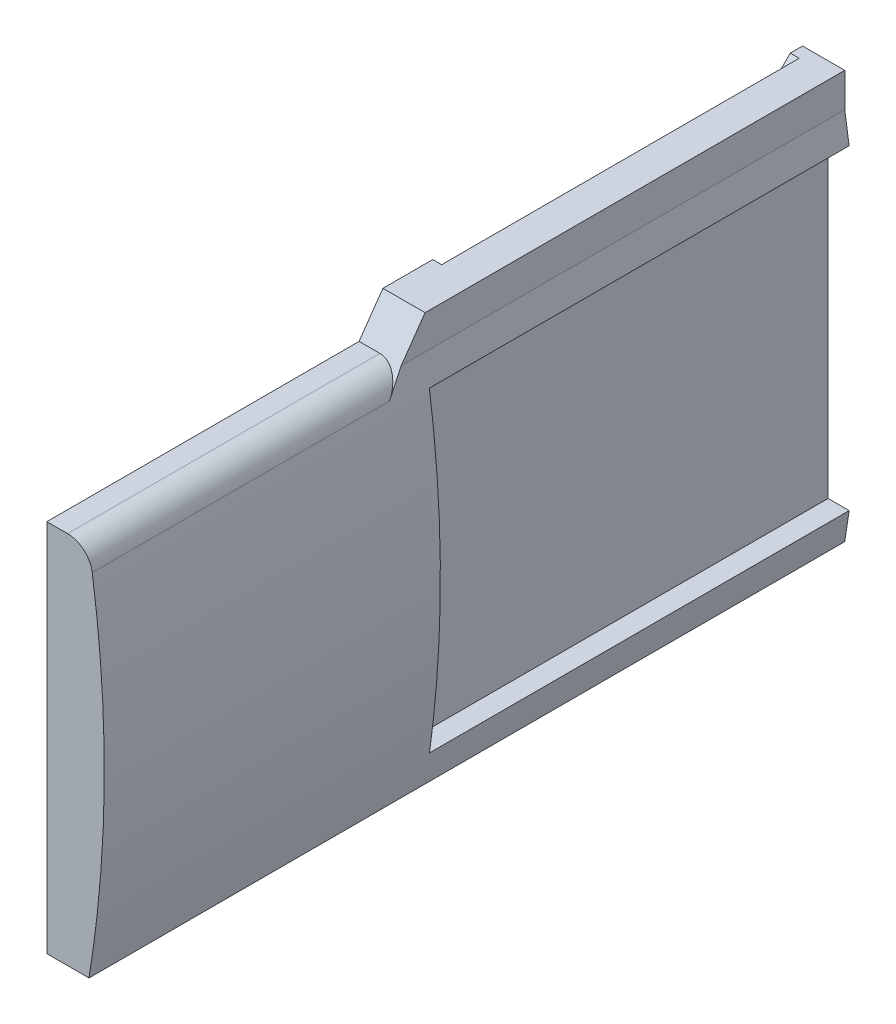
ISO-10303-21;
HEADER;
FILE_DESCRIPTION(('STEP AP214'),'2;1');
FILE_NAME('part.step','',(''),(''),'','','');
FILE_SCHEMA(('AUTOMOTIVE_DESIGN { 1 0 10303 214 1 1 1 1 }'));
ENDSEC;
DATA;
#1=APPLICATION_CONTEXT('core data for automotive mechanical design processes');
#2=APPLICATION_PROTOCOL_DEFINITION('international standard','automotive_design',2000,#1);
#3=PRODUCT_CONTEXT('',#1,'mechanical');
#4=PRODUCT('Part','Part','',(#3));
#5=PRODUCT_RELATED_PRODUCT_CATEGORY('part','',(#4));
#6=PRODUCT_DEFINITION_FORMATION('','',#4);
#7=PRODUCT_DEFINITION_CONTEXT('part definition',#1,'design');
#8=PRODUCT_DEFINITION('design','',#6,#7);
#9=PRODUCT_DEFINITION_SHAPE('','',#8);
#10=(LENGTH_UNIT() NAMED_UNIT(*) SI_UNIT(.MILLI.,.METRE.));
#11=(NAMED_UNIT(*) PLANE_ANGLE_UNIT() SI_UNIT($,.RADIAN.));
#12=(NAMED_UNIT(*) SI_UNIT($,.STERADIAN.) SOLID_ANGLE_UNIT());
#13=UNCERTAINTY_MEASURE_WITH_UNIT(LENGTH_MEASURE(1.E-05),#10,'distance_accuracy_value','');
#14=(GEOMETRIC_REPRESENTATION_CONTEXT(3) GLOBAL_UNCERTAINTY_ASSIGNED_CONTEXT((#13)) GLOBAL_UNIT_ASSIGNED_CONTEXT((#10,
#11,#12)) REPRESENTATION_CONTEXT('',''));
#15=CARTESIAN_POINT('',(0.,0.,0.));
#16=DIRECTION('',(0.,0.,1.));
#17=DIRECTION('',(1.,0.,0.));
#18=AXIS2_PLACEMENT_3D('',#15,#16,#17);
#19=CARTESIAN_POINT('',(100.042732586601,67.2945092184182,144.836492831407));
#20=DIRECTION('',(0.,-1.,0.));
#21=DIRECTION('',(0.,0.,-1.));
#22=AXIS2_PLACEMENT_3D('',#19,#20,#21);
#23=PLANE('',#22);
#24=DIRECTION('',(-1.,0.,0.));
#25=VECTOR('',#24,1.);
#26=CARTESIAN_POINT('',(100.042732586601,67.2945092184182,65.6364928314073));
#27=LINE('',#26,#25);
#28=CARTESIAN_POINT('',(94.9439960601416,67.2945092184182,65.6364928314073));
#29=VERTEX_POINT('',#28);
#30=CARTESIAN_POINT('',(90.,67.2945092184182,65.6364928314073));
#31=VERTEX_POINT('',#30);
#32=EDGE_CURVE('E187',#29,#31,#27,.T.);
#33=ORIENTED_EDGE('',*,*,#32,.T.);
#34=DIRECTION('',(0.,0.,1.));
#35=VECTOR('',#34,1.);
#36=CARTESIAN_POINT('',(90.,67.2945092184182,144.836492831407));
#37=LINE('',#36,#35);
#38=CARTESIAN_POINT('',(90.,67.2945092184182,140.));
#39=VERTEX_POINT('',#38);
#40=EDGE_CURVE('E185',#31,#39,#37,.T.);
#41=ORIENTED_EDGE('',*,*,#40,.T.);
#42=DIRECTION('',(-1.,0.,0.));
#43=VECTOR('',#42,1.);
#44=CARTESIAN_POINT('',(100.042732586601,67.2945092184182,140.));
#45=LINE('',#44,#43);
#46=CARTESIAN_POINT('',(94.9439960601416,67.2945092184182,140.));
#47=VERTEX_POINT('',#46);
#48=EDGE_CURVE('E173',#47,#39,#45,.T.);
#49=ORIENTED_EDGE('',*,*,#48,.F.);
#50=DIRECTION('',(0.,0.,1.));
#51=VECTOR('',#50,1.);
#52=CARTESIAN_POINT('',(94.9439960601416,67.2945092184182,65.6364928314073));
#53=LINE('',#52,#51);
#54=EDGE_CURVE('E364',#47,#29,#53,.F.);
#55=ORIENTED_EDGE('',*,*,#54,.T.);
#56=EDGE_LOOP('',(#33,#41,#49,#55));
#57=FACE_BOUND('',#56,.T.);
#58=ADVANCED_FACE('F63',(#57),#23,.F.);
#59=CARTESIAN_POINT('',(100.042732586601,-21.8054907815818,-54.6203206083434));
#60=DIRECTION('',(0.,1.,0.));
#61=DIRECTION('',(0.,0.,1.));
#62=AXIS2_PLACEMENT_3D('',#59,#60,#61);
#63=PLANE('',#62);
#64=DIRECTION('',(1.,0.,0.));
#65=VECTOR('',#64,1.);
#66=CARTESIAN_POINT('',(100.042732586601,-21.8054907815818,140.));
#67=LINE('',#66,#65);
#68=CARTESIAN_POINT('',(90.,-21.8054907815818,140.));
#69=VERTEX_POINT('',#68);
#70=CARTESIAN_POINT('',(100.042732586601,-21.8054907815818,140.));
#71=VERTEX_POINT('',#70);
#72=EDGE_CURVE('E181',#69,#71,#67,.T.);
#73=ORIENTED_EDGE('',*,*,#72,.F.);
#74=DIRECTION('',(0.,0.,-1.));
#75=VECTOR('',#74,1.);
#76=CARTESIAN_POINT('',(90.,-21.8054907815818,-54.6203206083434));
#77=LINE('',#76,#75);
#78=CARTESIAN_POINT('',(90.,-21.8054907815818,-40.));
#79=VERTEX_POINT('',#78);
#80=EDGE_CURVE('E79',#69,#79,#77,.T.);
#81=ORIENTED_EDGE('',*,*,#80,.T.);
#82=DIRECTION('',(1.,0.,0.));
#83=VECTOR('',#82,1.);
#84=CARTESIAN_POINT('',(100.042732586601,-21.8054907815818,-40.));
#85=LINE('',#84,#83);
#86=CARTESIAN_POINT('',(100.042732586601,-21.8054907815818,-40.));
#87=VERTEX_POINT('',#86);
#88=EDGE_CURVE('E234',#79,#87,#85,.T.);
#89=ORIENTED_EDGE('',*,*,#88,.T.);
#90=DIRECTION('',(0.,0.,-1.));
#91=VECTOR('',#90,1.);
#92=CARTESIAN_POINT('',(100.042732586601,-21.8054907815818,-54.6203206083434));
#93=LINE('',#92,#91);
#94=EDGE_CURVE('E356',#71,#87,#93,.T.);
#95=ORIENTED_EDGE('',*,*,#94,.F.);
#96=EDGE_LOOP('',(#73,#81,#89,#95));
#97=FACE_BOUND('',#96,.T.);
#98=ADVANCED_FACE('F302',(#97),#63,.F.);
#99=CARTESIAN_POINT('',(100.042732586601,67.2945092184182,311.41423626744));
#100=CARTESIAN_POINT('',(107.332112739832,22.4140596268838,311.41423626744));
#101=CARTESIAN_POINT('',(100.042732586601,-21.8054907815818,311.41423626744));
#102=B_SPLINE_CURVE_WITH_KNOTS('',2,(#99,#100,#101),.UNSPECIFIED.,.F.,.F.,(3,3),(0.,1.),.UNSPECIFIED.);
#103=DIRECTION('',(0.,0.,-1.));
#104=VECTOR('',#103,1.);
#105=SURFACE_OF_LINEAR_EXTRUSION('',#102,#104);
#106=DIRECTION('',(0.,0.,-1.));
#107=VECTOR('',#106,1.);
#108=CARTESIAN_POINT('',(100.823268570737,62.2017132942812,69.2025069280518));
#109=LINE('',#108,#107);
#110=CARTESIAN_POINT('',(100.823268570737,62.2017132942812,69.2025069280518));
#111=VERTEX_POINT('',#110);
#112=CARTESIAN_POINT('',(100.823268570737,62.2017132942812,140.));
#113=VERTEX_POINT('',#112);
#114=EDGE_CURVE('E319',#111,#113,#109,.F.);
#115=ORIENTED_EDGE('',*,*,#114,.T.);
#116=CARTESIAN_POINT('',(100.042732586601,67.2945092184182,140.));
#117=CARTESIAN_POINT('',(107.332112739832,22.4140596268838,140.));
#118=CARTESIAN_POINT('',(100.042732586601,-21.8054907815818,140.));
#119=B_SPLINE_CURVE_WITH_KNOTS('',2,(#116,#117,#118),.UNSPECIFIED.,.F.,.F.,(3,3),(0.,1.),.UNSPECIFIED.);
#120=EDGE_CURVE('E216',#113,#71,#119,.T.);
#121=ORIENTED_EDGE('',*,*,#120,.T.);
#122=ORIENTED_EDGE('',*,*,#94,.T.);
#123=CARTESIAN_POINT('',(100.042732586601,67.2945092184182,-40.));
#124=CARTESIAN_POINT('',(107.332112739832,22.4140596268838,-40.));
#125=CARTESIAN_POINT('',(100.042732586601,-21.8054907815818,-40.));
#126=B_SPLINE_CURVE_WITH_KNOTS('',2,(#123,#124,#125),.UNSPECIFIED.,.F.,.F.,(3,3),(0.,1.),.UNSPECIFIED.);
#127=CARTESIAN_POINT('',(101.095030730516,-14.8754907815819,-40.));
#128=VERTEX_POINT('',#127);
#129=EDGE_CURVE('E237',#128,#87,#126,.T.);
#130=ORIENTED_EDGE('',*,*,#129,.F.);
#131=DIRECTION('',(0.,0.,-1.));
#132=VECTOR('',#131,1.);
#133=CARTESIAN_POINT('',(101.095030730516,-14.875490781582,68.0911060975608));
#134=LINE('',#133,#132);
#135=CARTESIAN_POINT('',(101.095030730516,-14.875490781582,59.958086111532));
#136=VERTEX_POINT('',#135);
#137=EDGE_CURVE('E377',#136,#128,#134,.T.);
#138=ORIENTED_EDGE('',*,*,#137,.F.);
#139=CARTESIAN_POINT('',(100.042732586601,67.2945092184182,59.958086111532));
#140=CARTESIAN_POINT('',(107.332112739832,22.4140596268838,59.958086111532));
#141=CARTESIAN_POINT('',(100.042732586601,-21.8054907815818,59.958086111532));
#142=B_SPLINE_CURVE_WITH_KNOTS('',2,(#139,#140,#141),.UNSPECIFIED.,.F.,.F.,(3,3),(0.,1.),.UNSPECIFIED.);
#143=CARTESIAN_POINT('',(101.081930401724,60.3645092184182,59.958086111532));
#144=VERTEX_POINT('',#143);
#145=EDGE_CURVE('E389',#144,#136,#142,.T.);
#146=ORIENTED_EDGE('',*,*,#145,.F.);
#147=DIRECTION('',(0.,0.,-1.));
#148=VECTOR('',#147,1.);
#149=CARTESIAN_POINT('',(101.081930401724,60.3645092184181,68.0911060975608));
#150=LINE('',#149,#148);
#151=CARTESIAN_POINT('',(101.081930401733,60.3645092183522,-40.));
#152=VERTEX_POINT('',#151);
#153=EDGE_CURVE('E386',#152,#144,#150,.F.);
#154=ORIENTED_EDGE('',*,*,#153,.F.);
#155=CARTESIAN_POINT('',(100.042732586601,67.2945092184182,-40.));
#156=VERTEX_POINT('',#155);
#157=EDGE_CURVE('E243',#156,#152,#126,.T.);
#158=ORIENTED_EDGE('',*,*,#157,.F.);
#159=DIRECTION('',(0.,0.,-1.));
#160=VECTOR('',#159,1.);
#161=CARTESIAN_POINT('',(100.042732586601,67.2945092184182,311.41423626744));
#162=LINE('',#161,#160);
#163=CARTESIAN_POINT('',(100.042732586601,67.2945092184182,65.6364928314073));
#164=VERTEX_POINT('',#163);
#165=EDGE_CURVE('E285',#164,#156,#162,.T.);
#166=ORIENTED_EDGE('',*,*,#165,.F.);
#167=CARTESIAN_POINT('',(100.042732586601,67.2945092184182,65.6364928314073));
#168=CARTESIAN_POINT('',(100.180475250771,66.4464969731168,66.2302773980615));
#169=CARTESIAN_POINT('',(100.314391248202,65.5980911901213,66.8243375227756));
#170=CARTESIAN_POINT('',(100.57456990958,63.9004925487423,68.0130088883238));
#171=CARTESIAN_POINT('',(100.700832573529,63.0512996903588,68.6076201291578));
#172=CARTESIAN_POINT('',(100.823268570737,62.2017132942812,69.2025069280518));
#173=B_SPLINE_CURVE_WITH_KNOTS('',3,(#167,#168,#169,#170,#171,#172),.UNSPECIFIED.,.F.,.F.,(4,2,
4),(0.,3.13300170585157,6.26600341170315),.UNSPECIFIED.);
#174=EDGE_CURVE('E309',#164,#111,#173,.T.);
#175=ORIENTED_EDGE('',*,*,#174,.T.);
#176=EDGE_LOOP('',(#115,#121,#122,#130,#138,#146,#154,#158,#166,#175));
#177=FACE_BOUND('',#176,.T.);
#178=ADVANCED_FACE('F297',(#177),#105,.T.);
#179=CARTESIAN_POINT('',(94.9439960601416,61.3545092184182,105.236492831407));
#180=DIRECTION('',(0.,0.,-1.));
#181=DIRECTION('',(0.,1.,0.));
#182=AXIS2_PLACEMENT_3D('',#179,#180,#181);
#183=CYLINDRICAL_SURFACE('',#182,5.94);
#184=ORIENTED_EDGE('',*,*,#54,.F.);
#185=CARTESIAN_POINT('',(94.9439960601416,61.3545092184182,140.));
#186=DIRECTION('',(0.,0.,1.));
#187=DIRECTION('',(1.,0.,0.));
#188=AXIS2_PLACEMENT_3D('',#185,#186,#187);
#189=CIRCLE('',#188,5.94);
#190=EDGE_CURVE('E72',#47,#113,#189,.F.);
#191=ORIENTED_EDGE('',*,*,#190,.T.);
#192=ORIENTED_EDGE('',*,*,#114,.F.);
#193=CARTESIAN_POINT('',(94.9439960601416,61.3545092184182,69.795725608373));
#194=DIRECTION('',(0.,-0.573576436351045,-0.819152044288993));
#195=DIRECTION('',(0.,0.819152044288993,-0.573576436351045));
#196=AXIS2_PLACEMENT_3D('',#193,#194,#195);
#197=ELLIPSE('',#196,7.25140105724304,5.94);
#198=EDGE_CURVE('E366',#29,#111,#197,.T.);
#199=ORIENTED_EDGE('',*,*,#198,.F.);
#200=EDGE_LOOP('',(#184,#191,#192,#199));
#201=FACE_BOUND('',#200,.T.);
#202=ADVANCED_FACE('F65',(#201),#183,.T.);
#203=CARTESIAN_POINT('',(0.,0.,-40.));
#204=DIRECTION('',(0.,0.,1.));
#205=DIRECTION('',(1.,0.,0.));
#206=AXIS2_PLACEMENT_3D('',#203,#204,#205);
#207=PLANE('',#206);
#208=ORIENTED_EDGE('',*,*,#88,.F.);
#209=DIRECTION('',(0.,1.,0.));
#210=VECTOR('',#209,1.);
#211=CARTESIAN_POINT('',(90.,0.,-40.));
#212=LINE('',#211,#210);
#213=CARTESIAN_POINT('',(90.,75.4041144568792,-40.));
#214=VERTEX_POINT('',#213);
#215=EDGE_CURVE('E196',#79,#214,#212,.T.);
#216=ORIENTED_EDGE('',*,*,#215,.T.);
#217=DIRECTION('',(-1.,0.,0.));
#218=VECTOR('',#217,1.);
#219=CARTESIAN_POINT('',(100.042732586601,75.4041144568792,-40.));
#220=LINE('',#219,#218);
#221=CARTESIAN_POINT('',(100.042732586601,75.4041144568792,-40.));
#222=VERTEX_POINT('',#221);
#223=EDGE_CURVE('E180',#222,#214,#220,.T.);
#224=ORIENTED_EDGE('',*,*,#223,.F.);
#225=DIRECTION('',(0.,1.,0.));
#226=VECTOR('',#225,1.);
#227=CARTESIAN_POINT('',(100.042732586601,-21.8054907815818,-40.));
#228=LINE('',#227,#226);
#229=EDGE_CURVE('E230',#156,#222,#228,.T.);
#230=ORIENTED_EDGE('',*,*,#229,.F.);
#231=ORIENTED_EDGE('',*,*,#157,.T.);
#232=DIRECTION('',(1.,0.,0.));
#233=VECTOR('',#232,1.);
#234=CARTESIAN_POINT('',(96.0827325866005,60.3645092184182,-40.));
#235=LINE('',#234,#233);
#236=CARTESIAN_POINT('',(96.0827325866005,60.3645092184182,-40.));
#237=VERTEX_POINT('',#236);
#238=EDGE_CURVE('E251',#237,#152,#235,.T.);
#239=ORIENTED_EDGE('',*,*,#238,.F.);
#240=DIRECTION('',(0.,-1.,0.));
#241=VECTOR('',#240,1.);
#242=CARTESIAN_POINT('',(96.0827325866005,-21.8054907815818,-40.));
#243=LINE('',#242,#241);
#244=CARTESIAN_POINT('',(96.0827325866005,-14.8754907815818,-40.));
#245=VERTEX_POINT('',#244);
#246=EDGE_CURVE('E255',#237,#245,#243,.T.);
#247=ORIENTED_EDGE('',*,*,#246,.T.);
#248=DIRECTION('',(-1.,0.,0.));
#249=VECTOR('',#248,1.);
#250=CARTESIAN_POINT('',(96.0827325866005,-14.8754907815818,-40.));
#251=LINE('',#250,#249);
#252=EDGE_CURVE('E244',#128,#245,#251,.T.);
#253=ORIENTED_EDGE('',*,*,#252,.F.);
#254=ORIENTED_EDGE('',*,*,#129,.T.);
#255=EDGE_LOOP('',(#208,#216,#224,#230,#231,#239,#247,#253,#254));
#256=FACE_BOUND('',#255,.T.);
#257=ADVANCED_FACE('F341',(#256),#207,.F.);
#258=CARTESIAN_POINT('',(92.1227325866005,75.4041144568792,48.078086111532));
#259=DIRECTION('',(0.,-0.707106781186547,0.707106781186547));
#260=DIRECTION('',(-1.,0.,0.));
#261=AXIS2_PLACEMENT_3D('',#258,#259,#260);
#262=PLANE('',#261);
#263=DIRECTION('',(-0.577350269189626,-0.577350269189626,-0.577350269189626));
#264=VECTOR('',#263,1.);
#265=CARTESIAN_POINT('',(92.1227325866005,75.4041144568792,48.078086111532));
#266=LINE('',#265,#264);
#267=CARTESIAN_POINT('',(92.1227325866005,75.4041144568792,48.078086111532));
#268=VERTEX_POINT('',#267);
#269=CARTESIAN_POINT('',(90.,73.2813818702787,45.9553535249315));
#270=VERTEX_POINT('',#269);
#271=EDGE_CURVE('E320',#268,#270,#266,.T.);
#272=ORIENTED_EDGE('',*,*,#271,.T.);
#273=DIRECTION('',(0.,0.707106781186548,0.707106781186548));
#274=VECTOR('',#273,1.);
#275=CARTESIAN_POINT('',(90.,75.4041144568792,48.078086111532));
#276=LINE('',#275,#274);
#277=CARTESIAN_POINT('',(90.,75.4041144568792,48.078086111532));
#278=VERTEX_POINT('',#277);
#279=EDGE_CURVE('E205',#270,#278,#276,.T.);
#280=ORIENTED_EDGE('',*,*,#279,.T.);
#281=DIRECTION('',(1.,0.,0.));
#282=VECTOR('',#281,1.);
#283=CARTESIAN_POINT('',(92.1227325866005,75.4041144568792,48.078086111532));
#284=LINE('',#283,#282);
#285=EDGE_CURVE('E258',#278,#268,#284,.T.);
#286=ORIENTED_EDGE('',*,*,#285,.T.);
#287=EDGE_LOOP('',(#272,#280,#286));
#288=FACE_BOUND('',#287,.T.);
#289=ADVANCED_FACE('F339',(#288),#262,.F.);
#290=CARTESIAN_POINT('',(92.1227325866005,75.4041144568792,48.078086111532));
#291=DIRECTION('',(0.707106781186548,-0.707106781186547,0.));
#292=DIRECTION('',(0.,0.,1.));
#293=AXIS2_PLACEMENT_3D('',#290,#291,#292);
#294=PLANE('',#293);
#295=DIRECTION('',(-0.577350269189626,-0.577350269189626,0.577350269189626));
#296=VECTOR('',#295,1.);
#297=CARTESIAN_POINT('',(92.1227325866005,75.4041144568792,-37.061913888468));
#298=LINE('',#297,#296);
#299=CARTESIAN_POINT('',(92.1227325866005,75.4041144568792,-37.061913888468));
#300=VERTEX_POINT('',#299);
#301=CARTESIAN_POINT('',(90.,73.2813818702787,-34.9391813018675));
#302=VERTEX_POINT('',#301);
#303=EDGE_CURVE('E394',#300,#302,#298,.T.);
#304=ORIENTED_EDGE('',*,*,#303,.T.);
#305=DIRECTION('',(0.,0.,1.));
#306=VECTOR('',#305,1.);
#307=CARTESIAN_POINT('',(90.,73.2813818702787,48.078086111532));
#308=LINE('',#307,#306);
#309=EDGE_CURVE('E87',#302,#270,#308,.T.);
#310=ORIENTED_EDGE('',*,*,#309,.T.);
#311=ORIENTED_EDGE('',*,*,#271,.F.);
#312=DIRECTION('',(0.,0.,-1.));
#313=VECTOR('',#312,1.);
#314=CARTESIAN_POINT('',(92.1227325866005,75.4041144568792,48.078086111532));
#315=LINE('',#314,#313);
#316=EDGE_CURVE('E261',#268,#300,#315,.T.);
#317=ORIENTED_EDGE('',*,*,#316,.T.);
#318=EDGE_LOOP('',(#304,#310,#311,#317));
#319=FACE_BOUND('',#318,.T.);
#320=ADVANCED_FACE('F336',(#319),#294,.F.);
#321=CARTESIAN_POINT('',(92.1227325866005,75.4041144568792,-37.061913888468));
#322=DIRECTION('',(0.,-0.707106781186547,-0.707106781186548));
#323=DIRECTION('',(1.,0.,0.));
#324=AXIS2_PLACEMENT_3D('',#321,#322,#323);
#325=PLANE('',#324);
#326=DIRECTION('',(-1.,0.,0.));
#327=VECTOR('',#326,1.);
#328=CARTESIAN_POINT('',(92.1227325866005,75.4041144568792,-37.061913888468));
#329=LINE('',#328,#327);
#330=CARTESIAN_POINT('',(90.,75.4041144568792,-37.061913888468));
#331=VERTEX_POINT('',#330);
#332=EDGE_CURVE('E265',#300,#331,#329,.T.);
#333=ORIENTED_EDGE('',*,*,#332,.T.);
#334=DIRECTION('',(0.,-0.707106781186548,0.707106781186547));
#335=VECTOR('',#334,1.);
#336=CARTESIAN_POINT('',(90.,75.4041144568792,-37.061913888468));
#337=LINE('',#336,#335);
#338=EDGE_CURVE('E211',#331,#302,#337,.T.);
#339=ORIENTED_EDGE('',*,*,#338,.T.);
#340=ORIENTED_EDGE('',*,*,#303,.F.);
#341=EDGE_LOOP('',(#333,#339,#340));
#342=FACE_BOUND('',#341,.T.);
#343=ADVANCED_FACE('F332',(#342),#325,.F.);
#344=CARTESIAN_POINT('',(100.042732586601,75.4041144568792,59.958086111532));
#345=DIRECTION('',(0.,-1.,0.));
#346=DIRECTION('',(0.,0.,-1.));
#347=AXIS2_PLACEMENT_3D('',#344,#345,#346);
#348=PLANE('',#347);
#349=ORIENTED_EDGE('',*,*,#223,.T.);
#350=DIRECTION('',(0.,0.,1.));
#351=VECTOR('',#350,1.);
#352=CARTESIAN_POINT('',(90.,75.4041144568792,59.958086111532));
#353=LINE('',#352,#351);
#354=EDGE_CURVE('E206',#214,#331,#353,.T.);
#355=ORIENTED_EDGE('',*,*,#354,.T.);
#356=ORIENTED_EDGE('',*,*,#332,.F.);
#357=ORIENTED_EDGE('',*,*,#316,.F.);
#358=ORIENTED_EDGE('',*,*,#285,.F.);
#359=CARTESIAN_POINT('',(90.,75.4041144568792,59.958086111532));
#360=VERTEX_POINT('',#359);
#361=EDGE_CURVE('E202',#278,#360,#353,.T.);
#362=ORIENTED_EDGE('',*,*,#361,.T.);
#363=DIRECTION('',(-1.,0.,0.));
#364=VECTOR('',#363,1.);
#365=CARTESIAN_POINT('',(100.042732586601,75.4041144568792,59.958086111532));
#366=LINE('',#365,#364);
#367=CARTESIAN_POINT('',(100.042732586601,75.4041144568792,59.958086111532));
#368=VERTEX_POINT('',#367);
#369=EDGE_CURVE('E373',#368,#360,#366,.T.);
#370=ORIENTED_EDGE('',*,*,#369,.F.);
#371=DIRECTION('',(0.,0.,1.));
#372=VECTOR('',#371,1.);
#373=CARTESIAN_POINT('',(100.042732586601,75.4041144568792,59.958086111532));
#374=LINE('',#373,#372);
#375=EDGE_CURVE('E411',#222,#368,#374,.T.);
#376=ORIENTED_EDGE('',*,*,#375,.F.);
#377=EDGE_LOOP('',(#349,#355,#356,#357,#358,#362,#370,#376));
#378=FACE_BOUND('',#377,.T.);
#379=ADVANCED_FACE('F328',(#378),#348,.F.);
#380=CARTESIAN_POINT('',(100.042732586601,67.2945092184182,65.6364928314073));
#381=DIRECTION('',(0.,-0.573576436351045,-0.819152044288993));
#382=DIRECTION('',(0.,0.819152044288993,-0.573576436351045));
#383=AXIS2_PLACEMENT_3D('',#380,#381,#382);
#384=PLANE('',#383);
#385=ORIENTED_EDGE('',*,*,#369,.T.);
#386=DIRECTION('',(0.,-0.819152044288993,0.573576436351045));
#387=VECTOR('',#386,1.);
#388=CARTESIAN_POINT('',(90.,67.2945092184182,65.6364928314073));
#389=LINE('',#388,#387);
#390=EDGE_CURVE('E191',#360,#31,#389,.T.);
#391=ORIENTED_EDGE('',*,*,#390,.T.);
#392=ORIENTED_EDGE('',*,*,#32,.F.);
#393=ORIENTED_EDGE('',*,*,#198,.T.);
#394=ORIENTED_EDGE('',*,*,#174,.F.);
#395=DIRECTION('',(0.,-0.819152044288993,0.573576436351045));
#396=VECTOR('',#395,1.);
#397=CARTESIAN_POINT('',(100.042732586601,67.2945092184182,65.6364928314073));
#398=LINE('',#397,#396);
#399=EDGE_CURVE('E379',#368,#164,#398,.T.);
#400=ORIENTED_EDGE('',*,*,#399,.F.);
#401=EDGE_LOOP('',(#385,#391,#392,#393,#394,#400));
#402=FACE_BOUND('',#401,.T.);
#403=ADVANCED_FACE('F323',(#402),#384,.F.);
#404=CARTESIAN_POINT('',(100.042732586601,-21.8054907815818,-54.6203206083434));
#405=DIRECTION('',(-1.,0.,0.));
#406=DIRECTION('',(0.,0.,1.));
#407=AXIS2_PLACEMENT_3D('',#404,#405,#406);
#408=PLANE('',#407);
#409=ORIENTED_EDGE('',*,*,#165,.T.);
#410=ORIENTED_EDGE('',*,*,#229,.T.);
#411=ORIENTED_EDGE('',*,*,#375,.T.);
#412=ORIENTED_EDGE('',*,*,#399,.T.);
#413=EDGE_LOOP('',(#409,#410,#411,#412));
#414=FACE_BOUND('',#413,.T.);
#415=ADVANCED_FACE('F306',(#414),#408,.F.);
#416=CARTESIAN_POINT('',(96.0827325866005,60.3645092184182,59.958086111532));
#417=DIRECTION('',(0.,0.,1.));
#418=DIRECTION('',(0.,-1.,0.));
#419=AXIS2_PLACEMENT_3D('',#416,#417,#418);
#420=PLANE('',#419);
#421=ORIENTED_EDGE('',*,*,#145,.T.);
#422=DIRECTION('',(1.,0.,0.));
#423=VECTOR('',#422,1.);
#424=CARTESIAN_POINT('',(96.0827325866005,-14.8754907815818,59.958086111532));
#425=LINE('',#424,#423);
#426=CARTESIAN_POINT('',(96.0827325866005,-14.8754907815818,59.958086111532));
#427=VERTEX_POINT('',#426);
#428=EDGE_CURVE('E280',#427,#136,#425,.T.);
#429=ORIENTED_EDGE('',*,*,#428,.F.);
#430=DIRECTION('',(0.,-1.,0.));
#431=VECTOR('',#430,1.);
#432=CARTESIAN_POINT('',(96.0827325866005,60.3645092184182,59.958086111532));
#433=LINE('',#432,#431);
#434=CARTESIAN_POINT('',(96.0827325866005,60.3645092184182,59.958086111532));
#435=VERTEX_POINT('',#434);
#436=EDGE_CURVE('E269',#435,#427,#433,.T.);
#437=ORIENTED_EDGE('',*,*,#436,.F.);
#438=DIRECTION('',(1.,0.,0.));
#439=VECTOR('',#438,1.);
#440=CARTESIAN_POINT('',(96.0827325866005,60.3645092184182,59.958086111532));
#441=LINE('',#440,#439);
#442=EDGE_CURVE('E281',#435,#144,#441,.T.);
#443=ORIENTED_EDGE('',*,*,#442,.T.);
#444=EDGE_LOOP('',(#421,#429,#437,#443));
#445=FACE_BOUND('',#444,.T.);
#446=ADVANCED_FACE('F304',(#445),#420,.F.);
#447=CARTESIAN_POINT('',(96.0827325866005,60.3645092184182,59.958086111532));
#448=DIRECTION('',(0.,1.,0.));
#449=DIRECTION('',(0.,0.,1.));
#450=AXIS2_PLACEMENT_3D('',#447,#448,#449);
#451=PLANE('',#450);
#452=DIRECTION('',(0.,0.,1.));
#453=VECTOR('',#452,1.);
#454=CARTESIAN_POINT('',(96.0827325866005,60.3645092184182,59.958086111532));
#455=LINE('',#454,#453);
#456=EDGE_CURVE('E277',#237,#435,#455,.T.);
#457=ORIENTED_EDGE('',*,*,#456,.F.);
#458=ORIENTED_EDGE('',*,*,#238,.T.);
#459=ORIENTED_EDGE('',*,*,#153,.T.);
#460=ORIENTED_EDGE('',*,*,#442,.F.);
#461=EDGE_LOOP('',(#457,#458,#459,#460));
#462=FACE_BOUND('',#461,.T.);
#463=ADVANCED_FACE('F429',(#462),#451,.F.);
#464=CARTESIAN_POINT('',(96.0827325866005,-14.8754907815818,59.958086111532));
#465=DIRECTION('',(0.,-1.,0.));
#466=DIRECTION('',(0.,0.,-1.));
#467=AXIS2_PLACEMENT_3D('',#464,#465,#466);
#468=PLANE('',#467);
#469=ORIENTED_EDGE('',*,*,#137,.T.);
#470=ORIENTED_EDGE('',*,*,#252,.T.);
#471=DIRECTION('',(0.,0.,-1.));
#472=VECTOR('',#471,1.);
#473=CARTESIAN_POINT('',(96.0827325866005,-14.8754907815818,59.958086111532));
#474=LINE('',#473,#472);
#475=EDGE_CURVE('E273',#427,#245,#474,.T.);
#476=ORIENTED_EDGE('',*,*,#475,.F.);
#477=ORIENTED_EDGE('',*,*,#428,.T.);
#478=EDGE_LOOP('',(#469,#470,#476,#477));
#479=FACE_BOUND('',#478,.T.);
#480=ADVANCED_FACE('F422',(#479),#468,.F.);
#481=CARTESIAN_POINT('',(96.0827325866005,-21.8054907815818,-54.6203206083434));
#482=DIRECTION('',(1.,0.,0.));
#483=DIRECTION('',(0.,0.,-1.));
#484=AXIS2_PLACEMENT_3D('',#481,#482,#483);
#485=PLANE('',#484);
#486=ORIENTED_EDGE('',*,*,#246,.F.);
#487=ORIENTED_EDGE('',*,*,#456,.T.);
#488=ORIENTED_EDGE('',*,*,#436,.T.);
#489=ORIENTED_EDGE('',*,*,#475,.T.);
#490=EDGE_LOOP('',(#486,#487,#488,#489));
#491=FACE_BOUND('',#490,.T.);
#492=ADVANCED_FACE('F432',(#491),#485,.T.);
#493=CARTESIAN_POINT('',(0.,0.,140.));
#494=DIRECTION('',(0.,0.,1.));
#495=DIRECTION('',(1.,0.,0.));
#496=AXIS2_PLACEMENT_3D('',#493,#494,#495);
#497=PLANE('',#496);
#498=DIRECTION('',(0.,1.,0.));
#499=VECTOR('',#498,1.);
#500=CARTESIAN_POINT('',(90.,0.,140.));
#501=LINE('',#500,#499);
#502=EDGE_CURVE('E15',#69,#39,#501,.T.);
#503=ORIENTED_EDGE('',*,*,#502,.F.);
#504=ORIENTED_EDGE('',*,*,#72,.T.);
#505=ORIENTED_EDGE('',*,*,#120,.F.);
#506=ORIENTED_EDGE('',*,*,#190,.F.);
#507=ORIENTED_EDGE('',*,*,#48,.T.);
#508=EDGE_LOOP('',(#503,#504,#505,#506,#507));
#509=FACE_BOUND('',#508,.T.);
#510=ADVANCED_FACE('F175',(#509),#497,.T.);
#511=CARTESIAN_POINT('',(90.,0.,0.));
#512=DIRECTION('',(1.,0.,0.));
#513=DIRECTION('',(0.,0.,-1.));
#514=AXIS2_PLACEMENT_3D('',#511,#512,#513);
#515=PLANE('',#514);
#516=ORIENTED_EDGE('',*,*,#309,.F.);
#517=ORIENTED_EDGE('',*,*,#338,.F.);
#518=ORIENTED_EDGE('',*,*,#354,.F.);
#519=ORIENTED_EDGE('',*,*,#215,.F.);
#520=ORIENTED_EDGE('',*,*,#80,.F.);
#521=ORIENTED_EDGE('',*,*,#502,.T.);
#522=ORIENTED_EDGE('',*,*,#40,.F.);
#523=ORIENTED_EDGE('',*,*,#390,.F.);
#524=ORIENTED_EDGE('',*,*,#361,.F.);
#525=ORIENTED_EDGE('',*,*,#279,.F.);
#526=EDGE_LOOP('',(#516,#517,#518,#519,#520,#521,#522,#523,#524,#525));
#527=FACE_BOUND('',#526,.T.);
#528=ADVANCED_FACE('F193',(#527),#515,.F.);
#529=CLOSED_SHELL('',(#58,#98,#178,#202,#257,#289,#320,#343,#379,#403,#415,#446,#463,#480,#492,
#510,#528));
#530=MANIFOLD_SOLID_BREP('B2',#529);
#531=ADVANCED_BREP_SHAPE_REPRESENTATION('',(#18,#530),#14);
#532=SHAPE_DEFINITION_REPRESENTATION(#9,#531);
ENDSEC;
END-ISO-10303-21;
